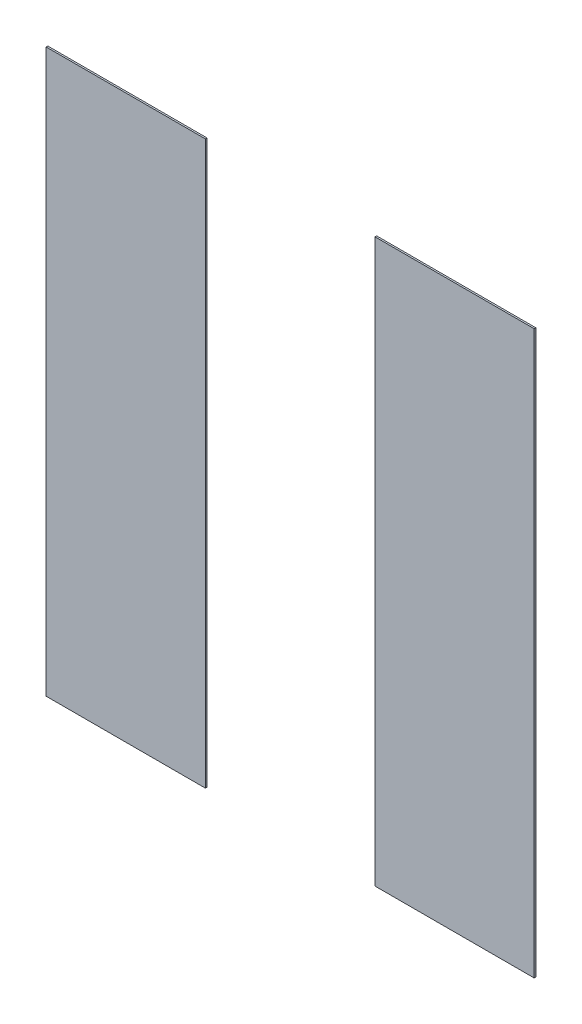
ISO-10303-21;
HEADER;
FILE_DESCRIPTION(('STEP AP214'),'2;1');
FILE_NAME('part.step','',(''),(''),'','','');
FILE_SCHEMA(('AUTOMOTIVE_DESIGN { 1 0 10303 214 1 1 1 1 }'));
ENDSEC;
DATA;
#1=APPLICATION_CONTEXT('core data for automotive mechanical design processes');
#2=APPLICATION_PROTOCOL_DEFINITION('international standard','automotive_design',2000,#1);
#3=PRODUCT_CONTEXT('',#1,'mechanical');
#4=PRODUCT('Part','Part','',(#3));
#5=PRODUCT_RELATED_PRODUCT_CATEGORY('part','',(#4));
#6=PRODUCT_DEFINITION_FORMATION('','',#4);
#7=PRODUCT_DEFINITION_CONTEXT('part definition',#1,'design');
#8=PRODUCT_DEFINITION('design','',#6,#7);
#9=PRODUCT_DEFINITION_SHAPE('','',#8);
#10=(LENGTH_UNIT() NAMED_UNIT(*) SI_UNIT(.MILLI.,.METRE.));
#11=(NAMED_UNIT(*) PLANE_ANGLE_UNIT() SI_UNIT($,.RADIAN.));
#12=(NAMED_UNIT(*) SI_UNIT($,.STERADIAN.) SOLID_ANGLE_UNIT());
#13=UNCERTAINTY_MEASURE_WITH_UNIT(LENGTH_MEASURE(1.E-05),#10,'distance_accuracy_value','');
#14=(GEOMETRIC_REPRESENTATION_CONTEXT(3) GLOBAL_UNCERTAINTY_ASSIGNED_CONTEXT((#13)) GLOBAL_UNIT_ASSIGNED_CONTEXT((#10,
#11,#12)) REPRESENTATION_CONTEXT('',''));
#15=CARTESIAN_POINT('',(0.,0.,0.));
#16=DIRECTION('',(0.,0.,1.));
#17=DIRECTION('',(1.,0.,0.));
#18=AXIS2_PLACEMENT_3D('',#15,#16,#17);
#19=CARTESIAN_POINT('',(2.921,3.3655,0.02));
#20=DIRECTION('',(-1.,0.,0.));
#21=DIRECTION('',(0.,-1.,0.));
#22=AXIS2_PLACEMENT_3D('',#19,#20,#21);
#23=PLANE('',#22);
#24=DIRECTION('',(0.,1.,0.));
#25=VECTOR('',#24,1.);
#26=CARTESIAN_POINT('',(2.921,3.3655,0.));
#27=LINE('',#26,#25);
#28=CARTESIAN_POINT('',(2.921,-3.3655,0.));
#29=VERTEX_POINT('',#28);
#30=CARTESIAN_POINT('',(2.921,3.3655,0.));
#31=VERTEX_POINT('',#30);
#32=EDGE_CURVE('E103',#29,#31,#27,.T.);
#33=ORIENTED_EDGE('',*,*,#32,.T.);
#34=DIRECTION('',(0.,0.,-1.));
#35=VECTOR('',#34,1.);
#36=CARTESIAN_POINT('',(2.921,3.3655,0.02));
#37=LINE('',#36,#35);
#38=CARTESIAN_POINT('',(2.921,3.3655,0.02));
#39=VERTEX_POINT('',#38);
#40=EDGE_CURVE('E12',#39,#31,#37,.T.);
#41=ORIENTED_EDGE('',*,*,#40,.F.);
#42=DIRECTION('',(0.,1.,0.));
#43=VECTOR('',#42,1.);
#44=CARTESIAN_POINT('',(2.921,3.3655,0.02));
#45=LINE('',#44,#43);
#46=CARTESIAN_POINT('',(2.921,-3.3655,0.02));
#47=VERTEX_POINT('',#46);
#48=EDGE_CURVE('E91',#47,#39,#45,.T.);
#49=ORIENTED_EDGE('',*,*,#48,.F.);
#50=DIRECTION('',(0.,0.,-1.));
#51=VECTOR('',#50,1.);
#52=CARTESIAN_POINT('',(2.921,-3.3655,0.02));
#53=LINE('',#52,#51);
#54=EDGE_CURVE('E99',#47,#29,#53,.T.);
#55=ORIENTED_EDGE('',*,*,#54,.T.);
#56=EDGE_LOOP('',(#33,#41,#49,#55));
#57=FACE_BOUND('',#56,.T.);
#58=ADVANCED_FACE('F40',(#57),#23,.F.);
#59=CARTESIAN_POINT('',(1.016,3.3655,0.02));
#60=DIRECTION('',(0.,-1.,0.));
#61=DIRECTION('',(0.,0.,-1.));
#62=AXIS2_PLACEMENT_3D('',#59,#60,#61);
#63=PLANE('',#62);
#64=DIRECTION('',(-1.,0.,0.));
#65=VECTOR('',#64,1.);
#66=CARTESIAN_POINT('',(1.016,3.3655,0.));
#67=LINE('',#66,#65);
#68=CARTESIAN_POINT('',(1.016,3.3655,0.));
#69=VERTEX_POINT('',#68);
#70=EDGE_CURVE('E95',#31,#69,#67,.T.);
#71=ORIENTED_EDGE('',*,*,#70,.T.);
#72=DIRECTION('',(0.,0.,-1.));
#73=VECTOR('',#72,1.);
#74=CARTESIAN_POINT('',(1.016,3.3655,0.02));
#75=LINE('',#74,#73);
#76=CARTESIAN_POINT('',(1.016,3.3655,0.02));
#77=VERTEX_POINT('',#76);
#78=EDGE_CURVE('E48',#77,#69,#75,.T.);
#79=ORIENTED_EDGE('',*,*,#78,.F.);
#80=DIRECTION('',(-1.,0.,0.));
#81=VECTOR('',#80,1.);
#82=CARTESIAN_POINT('',(1.016,3.3655,0.02));
#83=LINE('',#82,#81);
#84=EDGE_CURVE('E86',#39,#77,#83,.T.);
#85=ORIENTED_EDGE('',*,*,#84,.F.);
#86=ORIENTED_EDGE('',*,*,#40,.T.);
#87=EDGE_LOOP('',(#71,#79,#85,#86));
#88=FACE_BOUND('',#87,.T.);
#89=ADVANCED_FACE('F94',(#88),#63,.F.);
#90=CARTESIAN_POINT('',(1.016,3.3655,0.02));
#91=DIRECTION('',(1.,0.,0.));
#92=DIRECTION('',(0.,1.,0.));
#93=AXIS2_PLACEMENT_3D('',#90,#91,#92);
#94=PLANE('',#93);
#95=DIRECTION('',(0.,-1.,0.));
#96=VECTOR('',#95,1.);
#97=CARTESIAN_POINT('',(1.016,3.3655,0.));
#98=LINE('',#97,#96);
#99=CARTESIAN_POINT('',(1.016,-3.3655,0.));
#100=VERTEX_POINT('',#99);
#101=EDGE_CURVE('E73',#69,#100,#98,.T.);
#102=ORIENTED_EDGE('',*,*,#101,.T.);
#103=DIRECTION('',(0.,0.,-1.));
#104=VECTOR('',#103,1.);
#105=CARTESIAN_POINT('',(1.016,-3.3655,0.02));
#106=LINE('',#105,#104);
#107=CARTESIAN_POINT('',(1.016,-3.3655,0.02));
#108=VERTEX_POINT('',#107);
#109=EDGE_CURVE('E96',#108,#100,#106,.T.);
#110=ORIENTED_EDGE('',*,*,#109,.F.);
#111=DIRECTION('',(0.,-1.,0.));
#112=VECTOR('',#111,1.);
#113=CARTESIAN_POINT('',(1.016,3.3655,0.02));
#114=LINE('',#113,#112);
#115=EDGE_CURVE('E89',#77,#108,#114,.T.);
#116=ORIENTED_EDGE('',*,*,#115,.F.);
#117=ORIENTED_EDGE('',*,*,#78,.T.);
#118=EDGE_LOOP('',(#102,#110,#116,#117));
#119=FACE_BOUND('',#118,.T.);
#120=ADVANCED_FACE('F97',(#119),#94,.F.);
#121=CARTESIAN_POINT('',(1.016,-3.3655,0.02));
#122=DIRECTION('',(0.,1.,0.));
#123=DIRECTION('',(0.,0.,1.));
#124=AXIS2_PLACEMENT_3D('',#121,#122,#123);
#125=PLANE('',#124);
#126=DIRECTION('',(1.,0.,0.));
#127=VECTOR('',#126,1.);
#128=CARTESIAN_POINT('',(1.016,-3.3655,0.));
#129=LINE('',#128,#127);
#130=EDGE_CURVE('E79',#100,#29,#129,.T.);
#131=ORIENTED_EDGE('',*,*,#130,.T.);
#132=ORIENTED_EDGE('',*,*,#54,.F.);
#133=DIRECTION('',(1.,0.,0.));
#134=VECTOR('',#133,1.);
#135=CARTESIAN_POINT('',(1.016,-3.3655,0.02));
#136=LINE('',#135,#134);
#137=EDGE_CURVE('E56',#108,#47,#136,.T.);
#138=ORIENTED_EDGE('',*,*,#137,.F.);
#139=ORIENTED_EDGE('',*,*,#109,.T.);
#140=EDGE_LOOP('',(#131,#132,#138,#139));
#141=FACE_BOUND('',#140,.T.);
#142=ADVANCED_FACE('F110',(#141),#125,.F.);
#143=CARTESIAN_POINT('',(2.921,-3.3655,0.02));
#144=DIRECTION('',(0.,0.,1.));
#145=DIRECTION('',(1.,0.,0.));
#146=AXIS2_PLACEMENT_3D('',#143,#144,#145);
#147=PLANE('',#146);
#148=ORIENTED_EDGE('',*,*,#48,.T.);
#149=ORIENTED_EDGE('',*,*,#84,.T.);
#150=ORIENTED_EDGE('',*,*,#115,.T.);
#151=ORIENTED_EDGE('',*,*,#137,.T.);
#152=EDGE_LOOP('',(#148,#149,#150,#151));
#153=FACE_BOUND('',#152,.T.);
#154=ADVANCED_FACE('F87',(#153),#147,.T.);
#155=CARTESIAN_POINT('',(2.921,-3.3655,0.));
#156=DIRECTION('',(0.,0.,1.));
#157=DIRECTION('',(1.,0.,0.));
#158=AXIS2_PLACEMENT_3D('',#155,#156,#157);
#159=PLANE('',#158);
#160=ORIENTED_EDGE('',*,*,#32,.F.);
#161=ORIENTED_EDGE('',*,*,#130,.F.);
#162=ORIENTED_EDGE('',*,*,#101,.F.);
#163=ORIENTED_EDGE('',*,*,#70,.F.);
#164=EDGE_LOOP('',(#160,#161,#162,#163));
#165=FACE_BOUND('',#164,.T.);
#166=ADVANCED_FACE('F113',(#165),#159,.F.);
#167=CLOSED_SHELL('',(#58,#89,#120,#142,#154,#166));
#168=MANIFOLD_SOLID_BREP('B2',#167);
#169=CARTESIAN_POINT('',(-1.016,3.3655,0.02));
#170=DIRECTION('',(-1.,0.,0.));
#171=DIRECTION('',(0.,0.,1.));
#172=AXIS2_PLACEMENT_3D('',#169,#170,#171);
#173=PLANE('',#172);
#174=DIRECTION('',(0.,1.,0.));
#175=VECTOR('',#174,1.);
#176=CARTESIAN_POINT('',(-1.016,3.3655,0.));
#177=LINE('',#176,#175);
#178=CARTESIAN_POINT('',(-1.016,-3.3655,0.));
#179=VERTEX_POINT('',#178);
#180=CARTESIAN_POINT('',(-1.016,3.3655,0.));
#181=VERTEX_POINT('',#180);
#182=EDGE_CURVE('E226',#179,#181,#177,.T.);
#183=ORIENTED_EDGE('',*,*,#182,.T.);
#184=DIRECTION('',(0.,0.,-1.));
#185=VECTOR('',#184,1.);
#186=CARTESIAN_POINT('',(-1.016,3.3655,0.02));
#187=LINE('',#186,#185);
#188=CARTESIAN_POINT('',(-1.016,3.3655,0.02));
#189=VERTEX_POINT('',#188);
#190=EDGE_CURVE('E38',#189,#181,#187,.T.);
#191=ORIENTED_EDGE('',*,*,#190,.F.);
#192=DIRECTION('',(0.,1.,0.));
#193=VECTOR('',#192,1.);
#194=CARTESIAN_POINT('',(-1.016,3.3655,0.02));
#195=LINE('',#194,#193);
#196=CARTESIAN_POINT('',(-1.016,-3.3655,0.02));
#197=VERTEX_POINT('',#196);
#198=EDGE_CURVE('E214',#197,#189,#195,.T.);
#199=ORIENTED_EDGE('',*,*,#198,.F.);
#200=DIRECTION('',(0.,0.,-1.));
#201=VECTOR('',#200,1.);
#202=CARTESIAN_POINT('',(-1.016,-3.3655,0.02));
#203=LINE('',#202,#201);
#204=EDGE_CURVE('E222',#197,#179,#203,.T.);
#205=ORIENTED_EDGE('',*,*,#204,.T.);
#206=EDGE_LOOP('',(#183,#191,#199,#205));
#207=FACE_BOUND('',#206,.T.);
#208=ADVANCED_FACE('F163',(#207),#173,.F.);
#209=CARTESIAN_POINT('',(-2.921,3.3655,0.02));
#210=DIRECTION('',(0.,-1.,0.));
#211=DIRECTION('',(0.,0.,-1.));
#212=AXIS2_PLACEMENT_3D('',#209,#210,#211);
#213=PLANE('',#212);
#214=DIRECTION('',(-1.,0.,0.));
#215=VECTOR('',#214,1.);
#216=CARTESIAN_POINT('',(-2.921,3.3655,0.));
#217=LINE('',#216,#215);
#218=CARTESIAN_POINT('',(-2.921,3.3655,0.));
#219=VERTEX_POINT('',#218);
#220=EDGE_CURVE('E218',#181,#219,#217,.T.);
#221=ORIENTED_EDGE('',*,*,#220,.T.);
#222=DIRECTION('',(0.,0.,-1.));
#223=VECTOR('',#222,1.);
#224=CARTESIAN_POINT('',(-2.921,3.3655,0.02));
#225=LINE('',#224,#223);
#226=CARTESIAN_POINT('',(-2.921,3.3655,0.02));
#227=VERTEX_POINT('',#226);
#228=EDGE_CURVE('E171',#227,#219,#225,.T.);
#229=ORIENTED_EDGE('',*,*,#228,.F.);
#230=DIRECTION('',(-1.,0.,0.));
#231=VECTOR('',#230,1.);
#232=CARTESIAN_POINT('',(-2.921,3.3655,0.02));
#233=LINE('',#232,#231);
#234=EDGE_CURVE('E209',#189,#227,#233,.T.);
#235=ORIENTED_EDGE('',*,*,#234,.F.);
#236=ORIENTED_EDGE('',*,*,#190,.T.);
#237=EDGE_LOOP('',(#221,#229,#235,#236));
#238=FACE_BOUND('',#237,.T.);
#239=ADVANCED_FACE('F217',(#238),#213,.F.);
#240=CARTESIAN_POINT('',(-2.921,3.3655,0.02));
#241=DIRECTION('',(1.,0.,0.));
#242=DIRECTION('',(0.,0.,-1.));
#243=AXIS2_PLACEMENT_3D('',#240,#241,#242);
#244=PLANE('',#243);
#245=DIRECTION('',(0.,-1.,0.));
#246=VECTOR('',#245,1.);
#247=CARTESIAN_POINT('',(-2.921,3.3655,0.));
#248=LINE('',#247,#246);
#249=CARTESIAN_POINT('',(-2.921,-3.3655,0.));
#250=VERTEX_POINT('',#249);
#251=EDGE_CURVE('E196',#219,#250,#248,.T.);
#252=ORIENTED_EDGE('',*,*,#251,.T.);
#253=DIRECTION('',(0.,0.,-1.));
#254=VECTOR('',#253,1.);
#255=CARTESIAN_POINT('',(-2.921,-3.3655,0.02));
#256=LINE('',#255,#254);
#257=CARTESIAN_POINT('',(-2.921,-3.3655,0.02));
#258=VERTEX_POINT('',#257);
#259=EDGE_CURVE('E219',#258,#250,#256,.T.);
#260=ORIENTED_EDGE('',*,*,#259,.F.);
#261=DIRECTION('',(0.,-1.,0.));
#262=VECTOR('',#261,1.);
#263=CARTESIAN_POINT('',(-2.921,3.3655,0.02));
#264=LINE('',#263,#262);
#265=EDGE_CURVE('E212',#227,#258,#264,.T.);
#266=ORIENTED_EDGE('',*,*,#265,.F.);
#267=ORIENTED_EDGE('',*,*,#228,.T.);
#268=EDGE_LOOP('',(#252,#260,#266,#267));
#269=FACE_BOUND('',#268,.T.);
#270=ADVANCED_FACE('F220',(#269),#244,.F.);
#271=CARTESIAN_POINT('',(-2.921,-3.3655,0.02));
#272=DIRECTION('',(0.,1.,0.));
#273=DIRECTION('',(-1.,0.,0.));
#274=AXIS2_PLACEMENT_3D('',#271,#272,#273);
#275=PLANE('',#274);
#276=DIRECTION('',(1.,0.,0.));
#277=VECTOR('',#276,1.);
#278=CARTESIAN_POINT('',(-2.921,-3.3655,0.));
#279=LINE('',#278,#277);
#280=EDGE_CURVE('E202',#250,#179,#279,.T.);
#281=ORIENTED_EDGE('',*,*,#280,.T.);
#282=ORIENTED_EDGE('',*,*,#204,.F.);
#283=DIRECTION('',(1.,0.,0.));
#284=VECTOR('',#283,1.);
#285=CARTESIAN_POINT('',(-2.921,-3.3655,0.02));
#286=LINE('',#285,#284);
#287=EDGE_CURVE('E179',#258,#197,#286,.T.);
#288=ORIENTED_EDGE('',*,*,#287,.F.);
#289=ORIENTED_EDGE('',*,*,#259,.T.);
#290=EDGE_LOOP('',(#281,#282,#288,#289));
#291=FACE_BOUND('',#290,.T.);
#292=ADVANCED_FACE('F233',(#291),#275,.F.);
#293=CARTESIAN_POINT('',(-1.016,-3.3655,0.02));
#294=DIRECTION('',(0.,0.,1.));
#295=DIRECTION('',(1.,0.,0.));
#296=AXIS2_PLACEMENT_3D('',#293,#294,#295);
#297=PLANE('',#296);
#298=ORIENTED_EDGE('',*,*,#198,.T.);
#299=ORIENTED_EDGE('',*,*,#234,.T.);
#300=ORIENTED_EDGE('',*,*,#265,.T.);
#301=ORIENTED_EDGE('',*,*,#287,.T.);
#302=EDGE_LOOP('',(#298,#299,#300,#301));
#303=FACE_BOUND('',#302,.T.);
#304=ADVANCED_FACE('F210',(#303),#297,.T.);
#305=CARTESIAN_POINT('',(-1.016,-3.3655,0.));
#306=DIRECTION('',(0.,0.,1.));
#307=DIRECTION('',(1.,0.,0.));
#308=AXIS2_PLACEMENT_3D('',#305,#306,#307);
#309=PLANE('',#308);
#310=ORIENTED_EDGE('',*,*,#182,.F.);
#311=ORIENTED_EDGE('',*,*,#280,.F.);
#312=ORIENTED_EDGE('',*,*,#251,.F.);
#313=ORIENTED_EDGE('',*,*,#220,.F.);
#314=EDGE_LOOP('',(#310,#311,#312,#313));
#315=FACE_BOUND('',#314,.T.);
#316=ADVANCED_FACE('F236',(#315),#309,.F.);
#317=CLOSED_SHELL('',(#208,#239,#270,#292,#304,#316));
#318=MANIFOLD_SOLID_BREP('B6',#317);
#319=ADVANCED_BREP_SHAPE_REPRESENTATION('',(#18,#168,#318),#14);
#320=SHAPE_DEFINITION_REPRESENTATION(#9,#319);
ENDSEC;
END-ISO-10303-21;
